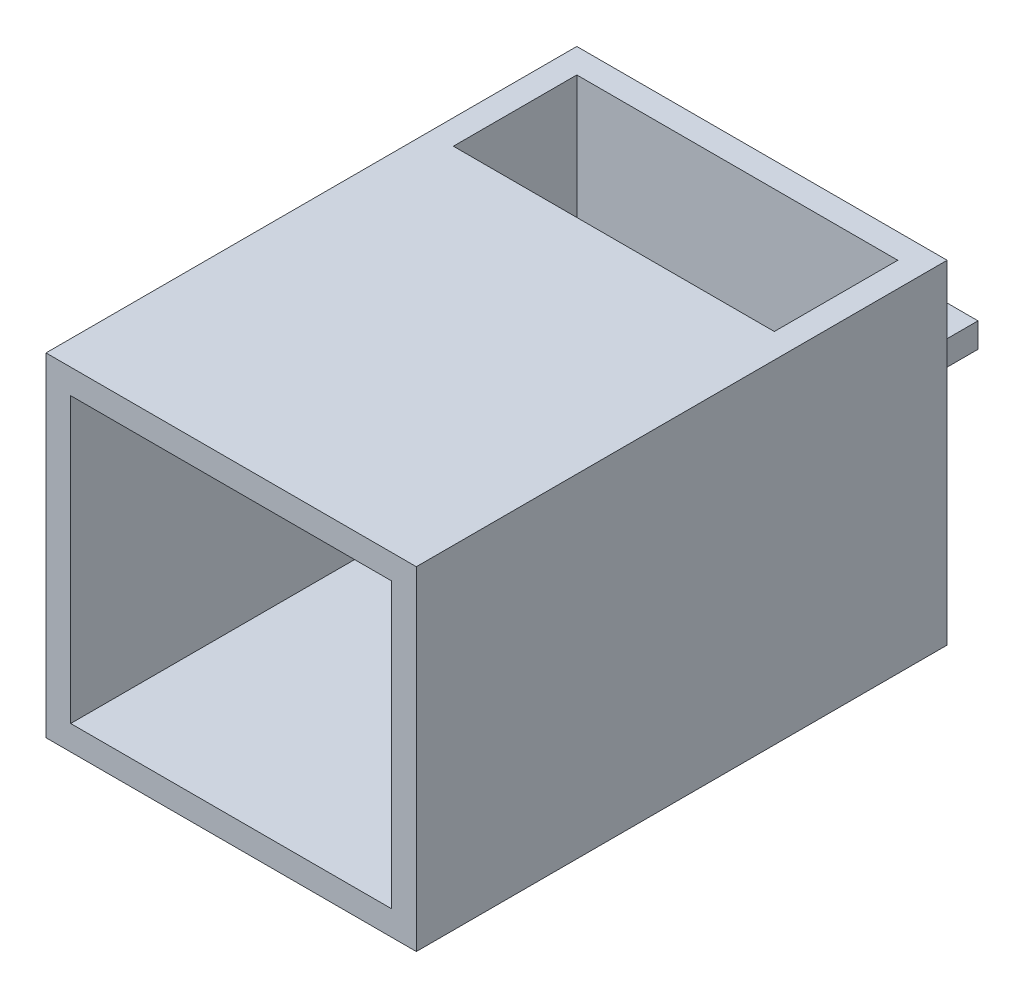
ISO-10303-21;
HEADER;
FILE_DESCRIPTION(('STEP AP214'),'2;1');
FILE_NAME('part.step','',(''),(''),'','','');
FILE_SCHEMA(('AUTOMOTIVE_DESIGN { 1 0 10303 214 1 1 1 1 }'));
ENDSEC;
DATA;
#1=APPLICATION_CONTEXT('core data for automotive mechanical design processes');
#2=APPLICATION_PROTOCOL_DEFINITION('international standard','automotive_design',2000,#1);
#3=PRODUCT_CONTEXT('',#1,'mechanical');
#4=PRODUCT('Part','Part','',(#3));
#5=PRODUCT_RELATED_PRODUCT_CATEGORY('part','',(#4));
#6=PRODUCT_DEFINITION_FORMATION('','',#4);
#7=PRODUCT_DEFINITION_CONTEXT('part definition',#1,'design');
#8=PRODUCT_DEFINITION('design','',#6,#7);
#9=PRODUCT_DEFINITION_SHAPE('','',#8);
#10=(LENGTH_UNIT() NAMED_UNIT(*) SI_UNIT(.MILLI.,.METRE.));
#11=(NAMED_UNIT(*) PLANE_ANGLE_UNIT() SI_UNIT($,.RADIAN.));
#12=(NAMED_UNIT(*) SI_UNIT($,.STERADIAN.) SOLID_ANGLE_UNIT());
#13=UNCERTAINTY_MEASURE_WITH_UNIT(LENGTH_MEASURE(1.E-05),#10,'distance_accuracy_value','');
#14=(GEOMETRIC_REPRESENTATION_CONTEXT(3) GLOBAL_UNCERTAINTY_ASSIGNED_CONTEXT((#13)) GLOBAL_UNIT_ASSIGNED_CONTEXT((#10,
#11,#12)) REPRESENTATION_CONTEXT('',''));
#15=CARTESIAN_POINT('',(0.,0.,0.));
#16=DIRECTION('',(0.,0.,1.));
#17=DIRECTION('',(1.,0.,0.));
#18=AXIS2_PLACEMENT_3D('',#15,#16,#17);
#19=CARTESIAN_POINT('',(-13.,-11.5,43.));
#20=DIRECTION('',(0.,1.,0.));
#21=DIRECTION('',(0.,0.,1.));
#22=AXIS2_PLACEMENT_3D('',#19,#20,#21);
#23=PLANE('',#22);
#24=DIRECTION('',(0.,0.,1.));
#25=VECTOR('',#24,1.);
#26=CARTESIAN_POINT('',(2.5,-11.5,-10.));
#27=LINE('',#26,#25);
#28=CARTESIAN_POINT('',(2.5,-11.5,-4.5));
#29=VERTEX_POINT('',#28);
#30=CARTESIAN_POINT('',(2.5,-11.5,0.));
#31=VERTEX_POINT('',#30);
#32=EDGE_CURVE('E315',#29,#31,#27,.T.);
#33=ORIENTED_EDGE('',*,*,#32,.F.);
#34=DIRECTION('',(1.,0.,0.));
#35=VECTOR('',#34,1.);
#36=CARTESIAN_POINT('',(-13.,-11.5,-4.5));
#37=LINE('',#36,#35);
#38=CARTESIAN_POINT('',(-2.5,-11.5,-4.5));
#39=VERTEX_POINT('',#38);
#40=EDGE_CURVE('E449',#29,#39,#37,.F.);
#41=ORIENTED_EDGE('',*,*,#40,.T.);
#42=DIRECTION('',(0.,0.,1.));
#43=VECTOR('',#42,1.);
#44=CARTESIAN_POINT('',(-2.5,-11.5,-10.));
#45=LINE('',#44,#43);
#46=CARTESIAN_POINT('',(-2.5,-11.5,0.));
#47=VERTEX_POINT('',#46);
#48=EDGE_CURVE('E312',#39,#47,#45,.T.);
#49=ORIENTED_EDGE('',*,*,#48,.T.);
#50=DIRECTION('',(1.,0.,0.));
#51=VECTOR('',#50,1.);
#52=CARTESIAN_POINT('',(-13.,-11.5,0.));
#53=LINE('',#52,#51);
#54=CARTESIAN_POINT('',(-13.,-11.5,0.));
#55=VERTEX_POINT('',#54);
#56=EDGE_CURVE('E348',#55,#47,#53,.T.);
#57=ORIENTED_EDGE('',*,*,#56,.F.);
#58=DIRECTION('',(0.,0.,-1.));
#59=VECTOR('',#58,1.);
#60=CARTESIAN_POINT('',(-13.,-11.5,43.));
#61=LINE('',#60,#59);
#62=CARTESIAN_POINT('',(-13.,-11.5,43.));
#63=VERTEX_POINT('',#62);
#64=EDGE_CURVE('E372',#63,#55,#61,.T.);
#65=ORIENTED_EDGE('',*,*,#64,.F.);
#66=DIRECTION('',(1.,0.,0.));
#67=VECTOR('',#66,1.);
#68=CARTESIAN_POINT('',(-13.,-11.5,43.));
#69=LINE('',#68,#67);
#70=CARTESIAN_POINT('',(13.,-11.5,43.));
#71=VERTEX_POINT('',#70);
#72=EDGE_CURVE('E355',#63,#71,#69,.T.);
#73=ORIENTED_EDGE('',*,*,#72,.T.);
#74=DIRECTION('',(0.,0.,-1.));
#75=VECTOR('',#74,1.);
#76=CARTESIAN_POINT('',(13.,-11.5,43.));
#77=LINE('',#76,#75);
#78=CARTESIAN_POINT('',(13.,-11.5,0.));
#79=VERTEX_POINT('',#78);
#80=EDGE_CURVE('E358',#71,#79,#77,.T.);
#81=ORIENTED_EDGE('',*,*,#80,.T.);
#82=EDGE_CURVE('E365',#31,#79,#53,.T.);
#83=ORIENTED_EDGE('',*,*,#82,.F.);
#84=EDGE_LOOP('',(#33,#41,#49,#57,#65,#73,#81,#83));
#85=FACE_BOUND('',#84,.T.);
#86=ADVANCED_FACE('F44',(#85),#23,.T.);
#87=CARTESIAN_POINT('',(-2.5,-11.5,-10.));
#88=DIRECTION('',(-1.,0.,0.));
#89=DIRECTION('',(0.,-1.,0.));
#90=AXIS2_PLACEMENT_3D('',#87,#88,#89);
#91=PLANE('',#90);
#92=ORIENTED_EDGE('',*,*,#48,.F.);
#93=CARTESIAN_POINT('',(-2.5,-12.,-4.5));
#94=DIRECTION('',(-1.,0.,0.));
#95=DIRECTION('',(0.,-1.,0.));
#96=AXIS2_PLACEMENT_3D('',#93,#94,#95);
#97=CIRCLE('',#96,0.5);
#98=CARTESIAN_POINT('',(-2.5,-12.,-5.));
#99=VERTEX_POINT('',#98);
#100=EDGE_CURVE('E458',#39,#99,#97,.T.);
#101=ORIENTED_EDGE('',*,*,#100,.T.);
#102=DIRECTION('',(0.,1.,0.));
#103=VECTOR('',#102,1.);
#104=CARTESIAN_POINT('',(-2.5,-11.5,-5.));
#105=LINE('',#104,#103);
#106=CARTESIAN_POINT('',(-2.5,-13.2928932188135,-5.));
#107=VERTEX_POINT('',#106);
#108=EDGE_CURVE('E246',#107,#99,#105,.T.);
#109=ORIENTED_EDGE('',*,*,#108,.F.);
#110=CARTESIAN_POINT('',(-2.5,-13.2928932188135,-4.5));
#111=DIRECTION('',(-1.,0.,0.));
#112=DIRECTION('',(0.,-1.,0.));
#113=AXIS2_PLACEMENT_3D('',#110,#111,#112);
#114=CIRCLE('',#113,0.5);
#115=CARTESIAN_POINT('',(-2.5,-13.6464466094067,-4.85355339059327));
#116=VERTEX_POINT('',#115);
#117=EDGE_CURVE('E455',#107,#116,#114,.T.);
#118=ORIENTED_EDGE('',*,*,#117,.T.);
#119=DIRECTION('',(0.,-0.707106781186548,0.707106781186548));
#120=VECTOR('',#119,1.);
#121=CARTESIAN_POINT('',(-2.5,-13.5,-5.));
#122=LINE('',#121,#120);
#123=CARTESIAN_POINT('',(-2.5,-14.6464466094067,-3.85355339059327));
#124=VERTEX_POINT('',#123);
#125=EDGE_CURVE('E250',#116,#124,#122,.T.);
#126=ORIENTED_EDGE('',*,*,#125,.T.);
#127=CARTESIAN_POINT('',(-2.5,-14.2928932188135,-3.5));
#128=DIRECTION('',(-1.,0.,0.));
#129=DIRECTION('',(0.,-1.,0.));
#130=AXIS2_PLACEMENT_3D('',#127,#128,#129);
#131=CIRCLE('',#130,0.5);
#132=CARTESIAN_POINT('',(-2.5,-14.2928932188135,-3.));
#133=VERTEX_POINT('',#132);
#134=EDGE_CURVE('E452',#124,#133,#131,.T.);
#135=ORIENTED_EDGE('',*,*,#134,.T.);
#136=DIRECTION('',(0.,1.,0.));
#137=VECTOR('',#136,1.);
#138=CARTESIAN_POINT('',(-2.5,-15.5,-3.));
#139=LINE('',#138,#137);
#140=CARTESIAN_POINT('',(-2.5,-13.5,-3.));
#141=VERTEX_POINT('',#140);
#142=EDGE_CURVE('E256',#133,#141,#139,.T.);
#143=ORIENTED_EDGE('',*,*,#142,.T.);
#144=DIRECTION('',(0.,0.,1.));
#145=VECTOR('',#144,1.);
#146=CARTESIAN_POINT('',(-2.5,-13.5,-10.));
#147=LINE('',#146,#145);
#148=CARTESIAN_POINT('',(-2.5,-13.5,0.));
#149=VERTEX_POINT('',#148);
#150=EDGE_CURVE('E268',#141,#149,#147,.T.);
#151=ORIENTED_EDGE('',*,*,#150,.T.);
#152=DIRECTION('',(0.,-1.,0.));
#153=VECTOR('',#152,1.);
#154=CARTESIAN_POINT('',(-2.5,-11.5,0.));
#155=LINE('',#154,#153);
#156=EDGE_CURVE('E290',#47,#149,#155,.T.);
#157=ORIENTED_EDGE('',*,*,#156,.F.);
#158=EDGE_LOOP('',(#92,#101,#109,#118,#126,#135,#143,#151,#157));
#159=FACE_BOUND('',#158,.T.);
#160=ADVANCED_FACE('F486',(#159),#91,.T.);
#161=CARTESIAN_POINT('',(2.5,-11.5,-10.));
#162=DIRECTION('',(-1.,0.,0.));
#163=DIRECTION('',(0.,-1.,0.));
#164=AXIS2_PLACEMENT_3D('',#161,#162,#163);
#165=PLANE('',#164);
#166=DIRECTION('',(0.,-1.,0.));
#167=VECTOR('',#166,1.);
#168=CARTESIAN_POINT('',(2.5,-11.5,-5.));
#169=LINE('',#168,#167);
#170=CARTESIAN_POINT('',(2.5,-12.,-5.));
#171=VERTEX_POINT('',#170);
#172=CARTESIAN_POINT('',(2.5,-13.2928932188135,-5.));
#173=VERTEX_POINT('',#172);
#174=EDGE_CURVE('E242',#171,#173,#169,.T.);
#175=ORIENTED_EDGE('',*,*,#174,.F.);
#176=CARTESIAN_POINT('',(2.5,-12.,-4.5));
#177=DIRECTION('',(-1.,0.,0.));
#178=DIRECTION('',(0.,-1.,0.));
#179=AXIS2_PLACEMENT_3D('',#176,#177,#178);
#180=CIRCLE('',#179,0.5);
#181=EDGE_CURVE('E446',#171,#29,#180,.F.);
#182=ORIENTED_EDGE('',*,*,#181,.T.);
#183=ORIENTED_EDGE('',*,*,#32,.T.);
#184=DIRECTION('',(0.,-1.,0.));
#185=VECTOR('',#184,1.);
#186=CARTESIAN_POINT('',(2.5,-11.5,0.));
#187=LINE('',#186,#185);
#188=CARTESIAN_POINT('',(2.5,-13.5,0.));
#189=VERTEX_POINT('',#188);
#190=EDGE_CURVE('E321',#31,#189,#187,.T.);
#191=ORIENTED_EDGE('',*,*,#190,.T.);
#192=DIRECTION('',(0.,0.,1.));
#193=VECTOR('',#192,1.);
#194=CARTESIAN_POINT('',(2.5,-13.5,-10.));
#195=LINE('',#194,#193);
#196=CARTESIAN_POINT('',(2.5,-13.5,-3.));
#197=VERTEX_POINT('',#196);
#198=EDGE_CURVE('E318',#197,#189,#195,.T.);
#199=ORIENTED_EDGE('',*,*,#198,.F.);
#200=DIRECTION('',(0.,1.,0.));
#201=VECTOR('',#200,1.);
#202=CARTESIAN_POINT('',(2.5,-15.5,-3.));
#203=LINE('',#202,#201);
#204=CARTESIAN_POINT('',(2.5,-14.2928932188135,-3.));
#205=VERTEX_POINT('',#204);
#206=EDGE_CURVE('E255',#205,#197,#203,.T.);
#207=ORIENTED_EDGE('',*,*,#206,.F.);
#208=CARTESIAN_POINT('',(2.5,-14.2928932188135,-3.5));
#209=DIRECTION('',(-1.,0.,0.));
#210=DIRECTION('',(0.,-1.,0.));
#211=AXIS2_PLACEMENT_3D('',#208,#209,#210);
#212=CIRCLE('',#211,0.5);
#213=CARTESIAN_POINT('',(2.5,-14.6464466094067,-3.85355339059327));
#214=VERTEX_POINT('',#213);
#215=EDGE_CURVE('E440',#205,#214,#212,.F.);
#216=ORIENTED_EDGE('',*,*,#215,.T.);
#217=DIRECTION('',(0.,-0.707106781186548,0.707106781186548));
#218=VECTOR('',#217,1.);
#219=CARTESIAN_POINT('',(2.5,-13.5,-5.));
#220=LINE('',#219,#218);
#221=CARTESIAN_POINT('',(2.5,-13.6464466094067,-4.85355339059327));
#222=VERTEX_POINT('',#221);
#223=EDGE_CURVE('E251',#222,#214,#220,.T.);
#224=ORIENTED_EDGE('',*,*,#223,.F.);
#225=CARTESIAN_POINT('',(2.5,-13.2928932188135,-4.5));
#226=DIRECTION('',(-1.,0.,0.));
#227=DIRECTION('',(0.,-1.,0.));
#228=AXIS2_PLACEMENT_3D('',#225,#226,#227);
#229=CIRCLE('',#228,0.5);
#230=EDGE_CURVE('E443',#222,#173,#229,.F.);
#231=ORIENTED_EDGE('',*,*,#230,.T.);
#232=EDGE_LOOP('',(#175,#182,#183,#191,#199,#207,#216,#224,#231));
#233=FACE_BOUND('',#232,.T.);
#234=ADVANCED_FACE('F475',(#233),#165,.F.);
#235=CARTESIAN_POINT('',(-15.,-13.5,43.));
#236=DIRECTION('',(0.,1.,0.));
#237=DIRECTION('',(0.,0.,1.));
#238=AXIS2_PLACEMENT_3D('',#235,#236,#237);
#239=PLANE('',#238);
#240=DIRECTION('',(-1.,0.,0.));
#241=VECTOR('',#240,1.);
#242=CARTESIAN_POINT('',(2.5,-13.5,-3.));
#243=LINE('',#242,#241);
#244=EDGE_CURVE('E259',#197,#141,#243,.T.);
#245=ORIENTED_EDGE('',*,*,#244,.F.);
#246=ORIENTED_EDGE('',*,*,#198,.T.);
#247=DIRECTION('',(1.,0.,0.));
#248=VECTOR('',#247,1.);
#249=CARTESIAN_POINT('',(-15.,-13.5,0.));
#250=LINE('',#249,#248);
#251=CARTESIAN_POINT('',(15.,-13.5,0.));
#252=VERTEX_POINT('',#251);
#253=EDGE_CURVE('E407',#189,#252,#250,.T.);
#254=ORIENTED_EDGE('',*,*,#253,.T.);
#255=DIRECTION('',(0.,0.,-1.));
#256=VECTOR('',#255,1.);
#257=CARTESIAN_POINT('',(15.,-13.5,43.));
#258=LINE('',#257,#256);
#259=CARTESIAN_POINT('',(15.,-13.5,43.));
#260=VERTEX_POINT('',#259);
#261=EDGE_CURVE('E397',#260,#252,#258,.T.);
#262=ORIENTED_EDGE('',*,*,#261,.F.);
#263=DIRECTION('',(1.,0.,0.));
#264=VECTOR('',#263,1.);
#265=CARTESIAN_POINT('',(-15.,-13.5,43.));
#266=LINE('',#265,#264);
#267=CARTESIAN_POINT('',(-15.,-13.5,43.));
#268=VERTEX_POINT('',#267);
#269=EDGE_CURVE('E394',#268,#260,#266,.T.);
#270=ORIENTED_EDGE('',*,*,#269,.F.);
#271=DIRECTION('',(0.,0.,-1.));
#272=VECTOR('',#271,1.);
#273=CARTESIAN_POINT('',(-15.,-13.5,43.));
#274=LINE('',#273,#272);
#275=CARTESIAN_POINT('',(-15.,-13.5,0.));
#276=VERTEX_POINT('',#275);
#277=EDGE_CURVE('E414',#268,#276,#274,.T.);
#278=ORIENTED_EDGE('',*,*,#277,.T.);
#279=EDGE_CURVE('E388',#276,#149,#250,.T.);
#280=ORIENTED_EDGE('',*,*,#279,.T.);
#281=ORIENTED_EDGE('',*,*,#150,.F.);
#282=EDGE_LOOP('',(#245,#246,#254,#262,#270,#278,#280,#281));
#283=FACE_BOUND('',#282,.T.);
#284=ADVANCED_FACE('F520',(#283),#239,.F.);
#285=CARTESIAN_POINT('',(0.,0.,0.));
#286=DIRECTION('',(0.,0.,1.));
#287=DIRECTION('',(1.,0.,0.));
#288=AXIS2_PLACEMENT_3D('',#285,#286,#287);
#289=PLANE('',#288);
#290=DIRECTION('',(0.,1.,0.));
#291=VECTOR('',#290,1.);
#292=CARTESIAN_POINT('',(-7.5,-1.5,0.));
#293=LINE('',#292,#291);
#294=CARTESIAN_POINT('',(-7.5,-1.5,0.));
#295=VERTEX_POINT('',#294);
#296=CARTESIAN_POINT('',(-7.5,0.500000000000001,0.));
#297=VERTEX_POINT('',#296);
#298=EDGE_CURVE('E289',#295,#297,#293,.T.);
#299=ORIENTED_EDGE('',*,*,#298,.F.);
#300=DIRECTION('',(-1.,0.,0.));
#301=VECTOR('',#300,1.);
#302=CARTESIAN_POINT('',(15.,-1.5,0.));
#303=LINE('',#302,#301);
#304=CARTESIAN_POINT('',(-13.,-1.5,0.));
#305=VERTEX_POINT('',#304);
#306=EDGE_CURVE('E301',#295,#305,#303,.T.);
#307=ORIENTED_EDGE('',*,*,#306,.T.);
#308=DIRECTION('',(0.,-1.,0.));
#309=VECTOR('',#308,1.);
#310=CARTESIAN_POINT('',(-13.,11.5,0.));
#311=LINE('',#310,#309);
#312=EDGE_CURVE('E362',#305,#55,#311,.T.);
#313=ORIENTED_EDGE('',*,*,#312,.T.);
#314=ORIENTED_EDGE('',*,*,#56,.T.);
#315=ORIENTED_EDGE('',*,*,#156,.T.);
#316=ORIENTED_EDGE('',*,*,#279,.F.);
#317=DIRECTION('',(0.,-1.,0.));
#318=VECTOR('',#317,1.);
#319=CARTESIAN_POINT('',(-15.,13.5,0.));
#320=LINE('',#319,#318);
#321=CARTESIAN_POINT('',(-15.,13.5,0.));
#322=VERTEX_POINT('',#321);
#323=EDGE_CURVE('E404',#322,#276,#320,.T.);
#324=ORIENTED_EDGE('',*,*,#323,.F.);
#325=DIRECTION('',(-1.,0.,0.));
#326=VECTOR('',#325,1.);
#327=CARTESIAN_POINT('',(-15.,13.5,0.));
#328=LINE('',#327,#326);
#329=CARTESIAN_POINT('',(15.,13.5,0.));
#330=VERTEX_POINT('',#329);
#331=EDGE_CURVE('E400',#330,#322,#328,.T.);
#332=ORIENTED_EDGE('',*,*,#331,.F.);
#333=DIRECTION('',(0.,1.,0.));
#334=VECTOR('',#333,1.);
#335=CARTESIAN_POINT('',(15.,13.5,0.));
#336=LINE('',#335,#334);
#337=EDGE_CURVE('E382',#252,#330,#336,.T.);
#338=ORIENTED_EDGE('',*,*,#337,.F.);
#339=ORIENTED_EDGE('',*,*,#253,.F.);
#340=ORIENTED_EDGE('',*,*,#190,.F.);
#341=ORIENTED_EDGE('',*,*,#82,.T.);
#342=DIRECTION('',(0.,1.,0.));
#343=VECTOR('',#342,1.);
#344=CARTESIAN_POINT('',(13.,11.5,0.));
#345=LINE('',#344,#343);
#346=CARTESIAN_POINT('',(13.,-1.5,0.));
#347=VERTEX_POINT('',#346);
#348=EDGE_CURVE('E343',#79,#347,#345,.T.);
#349=ORIENTED_EDGE('',*,*,#348,.T.);
#350=CARTESIAN_POINT('',(7.5,-1.5,0.));
#351=VERTEX_POINT('',#350);
#352=EDGE_CURVE('E333',#347,#351,#303,.T.);
#353=ORIENTED_EDGE('',*,*,#352,.T.);
#354=DIRECTION('',(0.,1.,0.));
#355=VECTOR('',#354,1.);
#356=CARTESIAN_POINT('',(7.5,-1.5,0.));
#357=LINE('',#356,#355);
#358=CARTESIAN_POINT('',(7.5,0.5,0.));
#359=VERTEX_POINT('',#358);
#360=EDGE_CURVE('E274',#351,#359,#357,.T.);
#361=ORIENTED_EDGE('',*,*,#360,.T.);
#362=DIRECTION('',(-1.,0.,0.));
#363=VECTOR('',#362,1.);
#364=CARTESIAN_POINT('',(7.5,0.5,0.));
#365=LINE('',#364,#363);
#366=EDGE_CURVE('E285',#359,#297,#365,.T.);
#367=ORIENTED_EDGE('',*,*,#366,.T.);
#368=EDGE_LOOP('',(#299,#307,#313,#314,#315,#316,#324,#332,#338,#339,#340,#341,#349,#353,#361,#367));
#369=FACE_BOUND('',#368,.T.);
#370=ADVANCED_FACE('F503',(#369),#289,.F.);
#371=CARTESIAN_POINT('',(-13.,11.5,43.));
#372=DIRECTION('',(0.,-1.,0.));
#373=DIRECTION('',(0.,0.,-1.));
#374=AXIS2_PLACEMENT_3D('',#371,#372,#373);
#375=PLANE('',#374);
#376=DIRECTION('',(-1.,0.,0.));
#377=VECTOR('',#376,1.);
#378=CARTESIAN_POINT('',(-13.,11.5,12.));
#379=LINE('',#378,#377);
#380=CARTESIAN_POINT('',(13.,11.5,12.));
#381=VERTEX_POINT('',#380);
#382=CARTESIAN_POINT('',(-13.,11.5,12.));
#383=VERTEX_POINT('',#382);
#384=EDGE_CURVE('E219',#381,#383,#379,.T.);
#385=ORIENTED_EDGE('',*,*,#384,.F.);
#386=DIRECTION('',(0.,0.,-1.));
#387=VECTOR('',#386,1.);
#388=CARTESIAN_POINT('',(13.,11.5,43.));
#389=LINE('',#388,#387);
#390=CARTESIAN_POINT('',(13.,11.5,43.));
#391=VERTEX_POINT('',#390);
#392=EDGE_CURVE('E217',#391,#381,#389,.T.);
#393=ORIENTED_EDGE('',*,*,#392,.F.);
#394=DIRECTION('',(-1.,0.,0.));
#395=VECTOR('',#394,1.);
#396=CARTESIAN_POINT('',(-13.,11.5,43.));
#397=LINE('',#396,#395);
#398=CARTESIAN_POINT('',(-13.,11.5,43.));
#399=VERTEX_POINT('',#398);
#400=EDGE_CURVE('E347',#391,#399,#397,.T.);
#401=ORIENTED_EDGE('',*,*,#400,.T.);
#402=DIRECTION('',(0.,0.,-1.));
#403=VECTOR('',#402,1.);
#404=CARTESIAN_POINT('',(-13.,11.5,43.));
#405=LINE('',#404,#403);
#406=EDGE_CURVE('E376',#399,#383,#405,.T.);
#407=ORIENTED_EDGE('',*,*,#406,.T.);
#408=EDGE_LOOP('',(#385,#393,#401,#407));
#409=FACE_BOUND('',#408,.T.);
#410=ADVANCED_FACE('F567',(#409),#375,.T.);
#411=CARTESIAN_POINT('',(0.,0.,43.));
#412=DIRECTION('',(0.,0.,1.));
#413=DIRECTION('',(1.,0.,0.));
#414=AXIS2_PLACEMENT_3D('',#411,#412,#413);
#415=PLANE('',#414);
#416=DIRECTION('',(0.,1.,0.));
#417=VECTOR('',#416,1.);
#418=CARTESIAN_POINT('',(15.,13.5,43.));
#419=LINE('',#418,#417);
#420=CARTESIAN_POINT('',(15.,13.5,43.));
#421=VERTEX_POINT('',#420);
#422=EDGE_CURVE('E383',#260,#421,#419,.T.);
#423=ORIENTED_EDGE('',*,*,#422,.T.);
#424=DIRECTION('',(-1.,0.,0.));
#425=VECTOR('',#424,1.);
#426=CARTESIAN_POINT('',(-15.,13.5,43.));
#427=LINE('',#426,#425);
#428=CARTESIAN_POINT('',(-15.,13.5,43.));
#429=VERTEX_POINT('',#428);
#430=EDGE_CURVE('E387',#421,#429,#427,.T.);
#431=ORIENTED_EDGE('',*,*,#430,.T.);
#432=DIRECTION('',(0.,-1.,0.));
#433=VECTOR('',#432,1.);
#434=CARTESIAN_POINT('',(-15.,13.5,43.));
#435=LINE('',#434,#433);
#436=EDGE_CURVE('E391',#429,#268,#435,.T.);
#437=ORIENTED_EDGE('',*,*,#436,.T.);
#438=ORIENTED_EDGE('',*,*,#269,.T.);
#439=EDGE_LOOP('',(#423,#431,#437,#438));
#440=FACE_BOUND('',#439,.T.);
#441=ORIENTED_EDGE('',*,*,#400,.F.);
#442=DIRECTION('',(0.,1.,0.));
#443=VECTOR('',#442,1.);
#444=CARTESIAN_POINT('',(13.,11.5,43.));
#445=LINE('',#444,#443);
#446=EDGE_CURVE('E344',#71,#391,#445,.T.);
#447=ORIENTED_EDGE('',*,*,#446,.F.);
#448=ORIENTED_EDGE('',*,*,#72,.F.);
#449=DIRECTION('',(0.,-1.,0.));
#450=VECTOR('',#449,1.);
#451=CARTESIAN_POINT('',(-13.,11.5,43.));
#452=LINE('',#451,#450);
#453=EDGE_CURVE('E351',#399,#63,#452,.T.);
#454=ORIENTED_EDGE('',*,*,#453,.F.);
#455=EDGE_LOOP('',(#441,#447,#448,#454));
#456=FACE_BOUND('',#455,.T.);
#457=ADVANCED_FACE('F570',(#440,#456),#415,.T.);
#458=CARTESIAN_POINT('',(15.,13.5,43.));
#459=DIRECTION('',(-1.,0.,0.));
#460=DIRECTION('',(0.,0.,1.));
#461=AXIS2_PLACEMENT_3D('',#458,#459,#460);
#462=PLANE('',#461);
#463=ORIENTED_EDGE('',*,*,#337,.T.);
#464=DIRECTION('',(0.,0.,-1.));
#465=VECTOR('',#464,1.);
#466=CARTESIAN_POINT('',(15.,13.5,43.));
#467=LINE('',#466,#465);
#468=EDGE_CURVE('E421',#421,#330,#467,.T.);
#469=ORIENTED_EDGE('',*,*,#468,.F.);
#470=ORIENTED_EDGE('',*,*,#422,.F.);
#471=ORIENTED_EDGE('',*,*,#261,.T.);
#472=EDGE_LOOP('',(#463,#469,#470,#471));
#473=FACE_BOUND('',#472,.T.);
#474=ADVANCED_FACE('F534',(#473),#462,.F.);
#475=CARTESIAN_POINT('',(-15.,13.5,43.));
#476=DIRECTION('',(0.,-1.,0.));
#477=DIRECTION('',(0.,0.,-1.));
#478=AXIS2_PLACEMENT_3D('',#475,#476,#477);
#479=PLANE('',#478);
#480=DIRECTION('',(1.,0.,0.));
#481=VECTOR('',#480,1.);
#482=CARTESIAN_POINT('',(-13.,13.5,12.));
#483=LINE('',#482,#481);
#484=CARTESIAN_POINT('',(-13.,13.5,12.));
#485=VERTEX_POINT('',#484);
#486=CARTESIAN_POINT('',(13.,13.5,12.));
#487=VERTEX_POINT('',#486);
#488=EDGE_CURVE('E223',#485,#487,#483,.T.);
#489=ORIENTED_EDGE('',*,*,#488,.F.);
#490=DIRECTION('',(0.,0.,1.));
#491=VECTOR('',#490,1.);
#492=CARTESIAN_POINT('',(-13.,13.5,2.));
#493=LINE('',#492,#491);
#494=CARTESIAN_POINT('',(-13.,13.5,2.));
#495=VERTEX_POINT('',#494);
#496=EDGE_CURVE('E60',#495,#485,#493,.T.);
#497=ORIENTED_EDGE('',*,*,#496,.F.);
#498=DIRECTION('',(-1.,0.,0.));
#499=VECTOR('',#498,1.);
#500=CARTESIAN_POINT('',(-13.,13.5,2.));
#501=LINE('',#500,#499);
#502=CARTESIAN_POINT('',(13.,13.5,2.));
#503=VERTEX_POINT('',#502);
#504=EDGE_CURVE('E231',#503,#495,#501,.T.);
#505=ORIENTED_EDGE('',*,*,#504,.F.);
#506=DIRECTION('',(0.,0.,-1.));
#507=VECTOR('',#506,1.);
#508=CARTESIAN_POINT('',(13.,13.5,2.));
#509=LINE('',#508,#507);
#510=EDGE_CURVE('E214',#487,#503,#509,.T.);
#511=ORIENTED_EDGE('',*,*,#510,.F.);
#512=EDGE_LOOP('',(#489,#497,#505,#511));
#513=FACE_BOUND('',#512,.T.);
#514=ORIENTED_EDGE('',*,*,#331,.T.);
#515=DIRECTION('',(0.,0.,-1.));
#516=VECTOR('',#515,1.);
#517=CARTESIAN_POINT('',(-15.,13.5,43.));
#518=LINE('',#517,#516);
#519=EDGE_CURVE('E418',#429,#322,#518,.T.);
#520=ORIENTED_EDGE('',*,*,#519,.F.);
#521=ORIENTED_EDGE('',*,*,#430,.F.);
#522=ORIENTED_EDGE('',*,*,#468,.T.);
#523=EDGE_LOOP('',(#514,#520,#521,#522));
#524=FACE_BOUND('',#523,.T.);
#525=ADVANCED_FACE('F228',(#513,#524),#479,.F.);
#526=CARTESIAN_POINT('',(-15.,13.5,43.));
#527=DIRECTION('',(1.,0.,0.));
#528=DIRECTION('',(0.,0.,-1.));
#529=AXIS2_PLACEMENT_3D('',#526,#527,#528);
#530=PLANE('',#529);
#531=ORIENTED_EDGE('',*,*,#323,.T.);
#532=ORIENTED_EDGE('',*,*,#277,.F.);
#533=ORIENTED_EDGE('',*,*,#436,.F.);
#534=ORIENTED_EDGE('',*,*,#519,.T.);
#535=EDGE_LOOP('',(#531,#532,#533,#534));
#536=FACE_BOUND('',#535,.T.);
#537=ADVANCED_FACE('F526',(#536),#530,.F.);
#538=CARTESIAN_POINT('',(13.,11.5,43.));
#539=DIRECTION('',(-1.,0.,0.));
#540=DIRECTION('',(0.,0.,1.));
#541=AXIS2_PLACEMENT_3D('',#538,#539,#540);
#542=PLANE('',#541);
#543=ORIENTED_EDGE('',*,*,#392,.T.);
#544=DIRECTION('',(0.,1.,0.));
#545=VECTOR('',#544,1.);
#546=CARTESIAN_POINT('',(13.,3.5,12.));
#547=LINE('',#546,#545);
#548=EDGE_CURVE('E68',#381,#487,#547,.T.);
#549=ORIENTED_EDGE('',*,*,#548,.T.);
#550=ORIENTED_EDGE('',*,*,#510,.T.);
#551=DIRECTION('',(0.,-1.,0.));
#552=VECTOR('',#551,1.);
#553=CARTESIAN_POINT('',(13.,11.5,2.));
#554=LINE('',#553,#552);
#555=CARTESIAN_POINT('',(13.,-1.5,2.));
#556=VERTEX_POINT('',#555);
#557=EDGE_CURVE('E332',#503,#556,#554,.T.);
#558=ORIENTED_EDGE('',*,*,#557,.T.);
#559=DIRECTION('',(0.,0.,1.));
#560=VECTOR('',#559,1.);
#561=CARTESIAN_POINT('',(13.,-1.5,43.));
#562=LINE('',#561,#560);
#563=EDGE_CURVE('E339',#347,#556,#562,.T.);
#564=ORIENTED_EDGE('',*,*,#563,.F.);
#565=ORIENTED_EDGE('',*,*,#348,.F.);
#566=ORIENTED_EDGE('',*,*,#80,.F.);
#567=ORIENTED_EDGE('',*,*,#446,.T.);
#568=EDGE_LOOP('',(#543,#549,#550,#558,#564,#565,#566,#567));
#569=FACE_BOUND('',#568,.T.);
#570=ADVANCED_FACE('F212',(#569),#542,.T.);
#571=CARTESIAN_POINT('',(-13.,11.5,43.));
#572=DIRECTION('',(1.,0.,0.));
#573=DIRECTION('',(0.,0.,-1.));
#574=AXIS2_PLACEMENT_3D('',#571,#572,#573);
#575=PLANE('',#574);
#576=DIRECTION('',(0.,1.,0.));
#577=VECTOR('',#576,1.);
#578=CARTESIAN_POINT('',(-13.,11.5,2.));
#579=LINE('',#578,#577);
#580=CARTESIAN_POINT('',(-13.,-1.5,2.));
#581=VERTEX_POINT('',#580);
#582=EDGE_CURVE('E425',#581,#495,#579,.T.);
#583=ORIENTED_EDGE('',*,*,#582,.T.);
#584=ORIENTED_EDGE('',*,*,#496,.T.);
#585=DIRECTION('',(0.,1.,0.));
#586=VECTOR('',#585,1.);
#587=CARTESIAN_POINT('',(-13.,3.5,12.));
#588=LINE('',#587,#586);
#589=EDGE_CURVE('E220',#383,#485,#588,.T.);
#590=ORIENTED_EDGE('',*,*,#589,.F.);
#591=ORIENTED_EDGE('',*,*,#406,.F.);
#592=ORIENTED_EDGE('',*,*,#453,.T.);
#593=ORIENTED_EDGE('',*,*,#64,.T.);
#594=ORIENTED_EDGE('',*,*,#312,.F.);
#595=DIRECTION('',(0.,0.,-1.));
#596=VECTOR('',#595,1.);
#597=CARTESIAN_POINT('',(-13.,-1.5,43.));
#598=LINE('',#597,#596);
#599=EDGE_CURVE('E428',#581,#305,#598,.T.);
#600=ORIENTED_EDGE('',*,*,#599,.F.);
#601=EDGE_LOOP('',(#583,#584,#590,#591,#592,#593,#594,#600));
#602=FACE_BOUND('',#601,.T.);
#603=ADVANCED_FACE('F510',(#602),#575,.T.);
#604=CARTESIAN_POINT('',(15.,-1.5,2.));
#605=DIRECTION('',(0.,-1.,0.));
#606=DIRECTION('',(0.,0.,-1.));
#607=AXIS2_PLACEMENT_3D('',#604,#605,#606);
#608=PLANE('',#607);
#609=ORIENTED_EDGE('',*,*,#352,.F.);
#610=ORIENTED_EDGE('',*,*,#563,.T.);
#611=DIRECTION('',(-1.,0.,0.));
#612=VECTOR('',#611,1.);
#613=CARTESIAN_POINT('',(15.,-1.5,2.));
#614=LINE('',#613,#612);
#615=EDGE_CURVE('E328',#556,#581,#614,.T.);
#616=ORIENTED_EDGE('',*,*,#615,.T.);
#617=ORIENTED_EDGE('',*,*,#599,.T.);
#618=ORIENTED_EDGE('',*,*,#306,.F.);
#619=DIRECTION('',(0.,0.,1.));
#620=VECTOR('',#619,1.);
#621=CARTESIAN_POINT('',(-7.5,-1.5,-10.));
#622=LINE('',#621,#620);
#623=CARTESIAN_POINT('',(-7.5,-1.5,-10.));
#624=VERTEX_POINT('',#623);
#625=EDGE_CURVE('E305',#624,#295,#622,.T.);
#626=ORIENTED_EDGE('',*,*,#625,.F.);
#627=DIRECTION('',(-1.,0.,0.));
#628=VECTOR('',#627,1.);
#629=CARTESIAN_POINT('',(7.5,-1.5,-10.));
#630=LINE('',#629,#628);
#631=CARTESIAN_POINT('',(7.5,-1.5,-10.));
#632=VERTEX_POINT('',#631);
#633=EDGE_CURVE('E277',#632,#624,#630,.T.);
#634=ORIENTED_EDGE('',*,*,#633,.F.);
#635=DIRECTION('',(0.,0.,1.));
#636=VECTOR('',#635,1.);
#637=CARTESIAN_POINT('',(7.5,-1.5,-10.));
#638=LINE('',#637,#636);
#639=EDGE_CURVE('E302',#632,#351,#638,.T.);
#640=ORIENTED_EDGE('',*,*,#639,.T.);
#641=EDGE_LOOP('',(#609,#610,#616,#617,#618,#626,#634,#640));
#642=FACE_BOUND('',#641,.T.);
#643=ADVANCED_FACE('F508',(#642),#608,.T.);
#644=CARTESIAN_POINT('',(0.,0.,2.));
#645=DIRECTION('',(0.,0.,-1.));
#646=DIRECTION('',(-1.,0.,0.));
#647=AXIS2_PLACEMENT_3D('',#644,#645,#646);
#648=PLANE('',#647);
#649=ORIENTED_EDGE('',*,*,#504,.T.);
#650=ORIENTED_EDGE('',*,*,#582,.F.);
#651=ORIENTED_EDGE('',*,*,#615,.F.);
#652=ORIENTED_EDGE('',*,*,#557,.F.);
#653=EDGE_LOOP('',(#649,#650,#651,#652));
#654=FACE_BOUND('',#653,.T.);
#655=ADVANCED_FACE('F641',(#654),#648,.F.);
#656=CARTESIAN_POINT('',(7.5,0.5,-10.));
#657=DIRECTION('',(0.,1.,0.));
#658=DIRECTION('',(-1.,0.,0.));
#659=AXIS2_PLACEMENT_3D('',#656,#657,#658);
#660=PLANE('',#659);
#661=ORIENTED_EDGE('',*,*,#366,.F.);
#662=DIRECTION('',(0.,0.,1.));
#663=VECTOR('',#662,1.);
#664=CARTESIAN_POINT('',(7.5,0.5,-10.));
#665=LINE('',#664,#663);
#666=CARTESIAN_POINT('',(7.5,0.5,-10.));
#667=VERTEX_POINT('',#666);
#668=EDGE_CURVE('E297',#667,#359,#665,.T.);
#669=ORIENTED_EDGE('',*,*,#668,.F.);
#670=DIRECTION('',(-1.,0.,0.));
#671=VECTOR('',#670,1.);
#672=CARTESIAN_POINT('',(7.5,0.5,-10.));
#673=LINE('',#672,#671);
#674=CARTESIAN_POINT('',(-7.5,0.500000000000001,-10.));
#675=VERTEX_POINT('',#674);
#676=EDGE_CURVE('E269',#667,#675,#673,.T.);
#677=ORIENTED_EDGE('',*,*,#676,.T.);
#678=DIRECTION('',(0.,0.,1.));
#679=VECTOR('',#678,1.);
#680=CARTESIAN_POINT('',(-7.5,0.500000000000001,-10.));
#681=LINE('',#680,#679);
#682=EDGE_CURVE('E284',#675,#297,#681,.T.);
#683=ORIENTED_EDGE('',*,*,#682,.T.);
#684=EDGE_LOOP('',(#661,#669,#677,#683));
#685=FACE_BOUND('',#684,.T.);
#686=ADVANCED_FACE('F645',(#685),#660,.T.);
#687=CARTESIAN_POINT('',(7.5,-1.5,-10.));
#688=DIRECTION('',(1.,0.,0.));
#689=DIRECTION('',(0.,0.,-1.));
#690=AXIS2_PLACEMENT_3D('',#687,#688,#689);
#691=PLANE('',#690);
#692=ORIENTED_EDGE('',*,*,#360,.F.);
#693=ORIENTED_EDGE('',*,*,#639,.F.);
#694=DIRECTION('',(0.,1.,0.));
#695=VECTOR('',#694,1.);
#696=CARTESIAN_POINT('',(7.5,-1.5,-10.));
#697=LINE('',#696,#695);
#698=EDGE_CURVE('E280',#632,#667,#697,.T.);
#699=ORIENTED_EDGE('',*,*,#698,.T.);
#700=ORIENTED_EDGE('',*,*,#668,.T.);
#701=EDGE_LOOP('',(#692,#693,#699,#700));
#702=FACE_BOUND('',#701,.T.);
#703=ADVANCED_FACE('F679',(#702),#691,.T.);
#704=CARTESIAN_POINT('',(-7.5,-1.5,-10.));
#705=DIRECTION('',(1.,0.,0.));
#706=DIRECTION('',(0.,0.,-1.));
#707=AXIS2_PLACEMENT_3D('',#704,#705,#706);
#708=PLANE('',#707);
#709=ORIENTED_EDGE('',*,*,#298,.T.);
#710=ORIENTED_EDGE('',*,*,#682,.F.);
#711=DIRECTION('',(0.,1.,0.));
#712=VECTOR('',#711,1.);
#713=CARTESIAN_POINT('',(-7.5,-1.5,-10.));
#714=LINE('',#713,#712);
#715=EDGE_CURVE('E273',#624,#675,#714,.T.);
#716=ORIENTED_EDGE('',*,*,#715,.F.);
#717=ORIENTED_EDGE('',*,*,#625,.T.);
#718=EDGE_LOOP('',(#709,#710,#716,#717));
#719=FACE_BOUND('',#718,.T.);
#720=ADVANCED_FACE('F551',(#719),#708,.F.);
#721=CARTESIAN_POINT('',(0.,0.,-10.));
#722=DIRECTION('',(0.,0.,-1.));
#723=DIRECTION('',(-1.,0.,0.));
#724=AXIS2_PLACEMENT_3D('',#721,#722,#723);
#725=PLANE('',#724);
#726=ORIENTED_EDGE('',*,*,#676,.F.);
#727=ORIENTED_EDGE('',*,*,#698,.F.);
#728=ORIENTED_EDGE('',*,*,#633,.T.);
#729=ORIENTED_EDGE('',*,*,#715,.T.);
#730=EDGE_LOOP('',(#726,#727,#728,#729));
#731=FACE_BOUND('',#730,.T.);
#732=ADVANCED_FACE('F543',(#731),#725,.T.);
#733=CARTESIAN_POINT('',(2.5,-15.5,-3.));
#734=DIRECTION('',(0.,0.,1.));
#735=DIRECTION('',(1.,0.,0.));
#736=AXIS2_PLACEMENT_3D('',#733,#734,#735);
#737=PLANE('',#736);
#738=ORIENTED_EDGE('',*,*,#142,.F.);
#739=DIRECTION('',(-1.,0.,0.));
#740=VECTOR('',#739,1.);
#741=CARTESIAN_POINT('',(2.5,-14.2928932188135,-3.));
#742=LINE('',#741,#740);
#743=EDGE_CURVE('E11',#133,#205,#742,.F.);
#744=ORIENTED_EDGE('',*,*,#743,.T.);
#745=ORIENTED_EDGE('',*,*,#206,.T.);
#746=ORIENTED_EDGE('',*,*,#244,.T.);
#747=EDGE_LOOP('',(#738,#744,#745,#746));
#748=FACE_BOUND('',#747,.T.);
#749=ADVANCED_FACE('F541',(#748),#737,.T.);
#750=CARTESIAN_POINT('',(2.5,-13.5,-5.));
#751=DIRECTION('',(0.,-0.707106781186548,-0.707106781186548));
#752=DIRECTION('',(0.,0.707106781186548,-0.707106781186548));
#753=AXIS2_PLACEMENT_3D('',#750,#751,#752);
#754=PLANE('',#753);
#755=ORIENTED_EDGE('',*,*,#125,.F.);
#756=DIRECTION('',(-1.,0.,0.));
#757=VECTOR('',#756,1.);
#758=CARTESIAN_POINT('',(2.5,-13.6464466094067,-4.85355339059327));
#759=LINE('',#758,#757);
#760=EDGE_CURVE('E53',#116,#222,#759,.F.);
#761=ORIENTED_EDGE('',*,*,#760,.T.);
#762=ORIENTED_EDGE('',*,*,#223,.T.);
#763=DIRECTION('',(-1.,0.,0.));
#764=VECTOR('',#763,1.);
#765=CARTESIAN_POINT('',(2.5,-14.6464466094067,-3.85355339059327));
#766=LINE('',#765,#764);
#767=EDGE_CURVE('E461',#214,#124,#766,.T.);
#768=ORIENTED_EDGE('',*,*,#767,.T.);
#769=EDGE_LOOP('',(#755,#761,#762,#768));
#770=FACE_BOUND('',#769,.T.);
#771=ADVANCED_FACE('F469',(#770),#754,.T.);
#772=CARTESIAN_POINT('',(0.,0.,-5.));
#773=DIRECTION('',(0.,0.,-1.));
#774=DIRECTION('',(-1.,0.,0.));
#775=AXIS2_PLACEMENT_3D('',#772,#773,#774);
#776=PLANE('',#775);
#777=ORIENTED_EDGE('',*,*,#108,.T.);
#778=DIRECTION('',(1.,0.,0.));
#779=VECTOR('',#778,1.);
#780=CARTESIAN_POINT('',(0.,-12.,-5.));
#781=LINE('',#780,#779);
#782=EDGE_CURVE('E436',#99,#171,#781,.T.);
#783=ORIENTED_EDGE('',*,*,#782,.T.);
#784=ORIENTED_EDGE('',*,*,#174,.T.);
#785=DIRECTION('',(-1.,0.,0.));
#786=VECTOR('',#785,1.);
#787=CARTESIAN_POINT('',(0.,-13.2928932188135,-5.));
#788=LINE('',#787,#786);
#789=EDGE_CURVE('E432',#173,#107,#788,.T.);
#790=ORIENTED_EDGE('',*,*,#789,.T.);
#791=EDGE_LOOP('',(#777,#783,#784,#790));
#792=FACE_BOUND('',#791,.T.);
#793=ADVANCED_FACE('F482',(#792),#776,.T.);
#794=CARTESIAN_POINT('',(0.,-12.,-4.5));
#795=DIRECTION('',(1.,0.,0.));
#796=DIRECTION('',(0.,0.,-1.));
#797=AXIS2_PLACEMENT_3D('',#794,#795,#796);
#798=CYLINDRICAL_SURFACE('',#797,0.5);
#799=ORIENTED_EDGE('',*,*,#100,.F.);
#800=ORIENTED_EDGE('',*,*,#40,.F.);
#801=ORIENTED_EDGE('',*,*,#181,.F.);
#802=ORIENTED_EDGE('',*,*,#782,.F.);
#803=EDGE_LOOP('',(#799,#800,#801,#802));
#804=FACE_BOUND('',#803,.T.);
#805=ADVANCED_FACE('F491',(#804),#798,.T.);
#806=CARTESIAN_POINT('',(0.,-13.2928932188135,-4.5));
#807=DIRECTION('',(-1.,0.,0.));
#808=DIRECTION('',(0.,-1.,0.));
#809=AXIS2_PLACEMENT_3D('',#806,#807,#808);
#810=CYLINDRICAL_SURFACE('',#809,0.5);
#811=ORIENTED_EDGE('',*,*,#230,.F.);
#812=ORIENTED_EDGE('',*,*,#760,.F.);
#813=ORIENTED_EDGE('',*,*,#117,.F.);
#814=ORIENTED_EDGE('',*,*,#789,.F.);
#815=EDGE_LOOP('',(#811,#812,#813,#814));
#816=FACE_BOUND('',#815,.T.);
#817=ADVANCED_FACE('F479',(#816),#810,.T.);
#818=CARTESIAN_POINT('',(2.5,-14.2928932188135,-3.5));
#819=DIRECTION('',(-1.,0.,0.));
#820=DIRECTION('',(0.,-1.,0.));
#821=AXIS2_PLACEMENT_3D('',#818,#819,#820);
#822=CYLINDRICAL_SURFACE('',#821,0.5);
#823=ORIENTED_EDGE('',*,*,#215,.F.);
#824=ORIENTED_EDGE('',*,*,#743,.F.);
#825=ORIENTED_EDGE('',*,*,#134,.F.);
#826=ORIENTED_EDGE('',*,*,#767,.F.);
#827=EDGE_LOOP('',(#823,#824,#825,#826));
#828=FACE_BOUND('',#827,.T.);
#829=ADVANCED_FACE('F46',(#828),#822,.T.);
#830=CARTESIAN_POINT('',(-13.,3.5,12.));
#831=DIRECTION('',(0.,0.,1.));
#832=DIRECTION('',(1.,0.,0.));
#833=AXIS2_PLACEMENT_3D('',#830,#831,#832);
#834=PLANE('',#833);
#835=ORIENTED_EDGE('',*,*,#384,.T.);
#836=ORIENTED_EDGE('',*,*,#589,.T.);
#837=ORIENTED_EDGE('',*,*,#488,.T.);
#838=ORIENTED_EDGE('',*,*,#548,.F.);
#839=EDGE_LOOP('',(#835,#836,#837,#838));
#840=FACE_BOUND('',#839,.T.);
#841=ADVANCED_FACE('F224',(#840),#834,.F.);
#842=CLOSED_SHELL('',(#86,#160,#234,#284,#370,#410,#457,#474,#525,#537,#570,#603,#643,#655,#686,
#703,#720,#732,#749,#771,#793,#805,#817,#829,#841));
#843=MANIFOLD_SOLID_BREP('B2',#842);
#844=ADVANCED_BREP_SHAPE_REPRESENTATION('',(#18,#843),#14);
#845=SHAPE_DEFINITION_REPRESENTATION(#9,#844);
ENDSEC;
END-ISO-10303-21;
